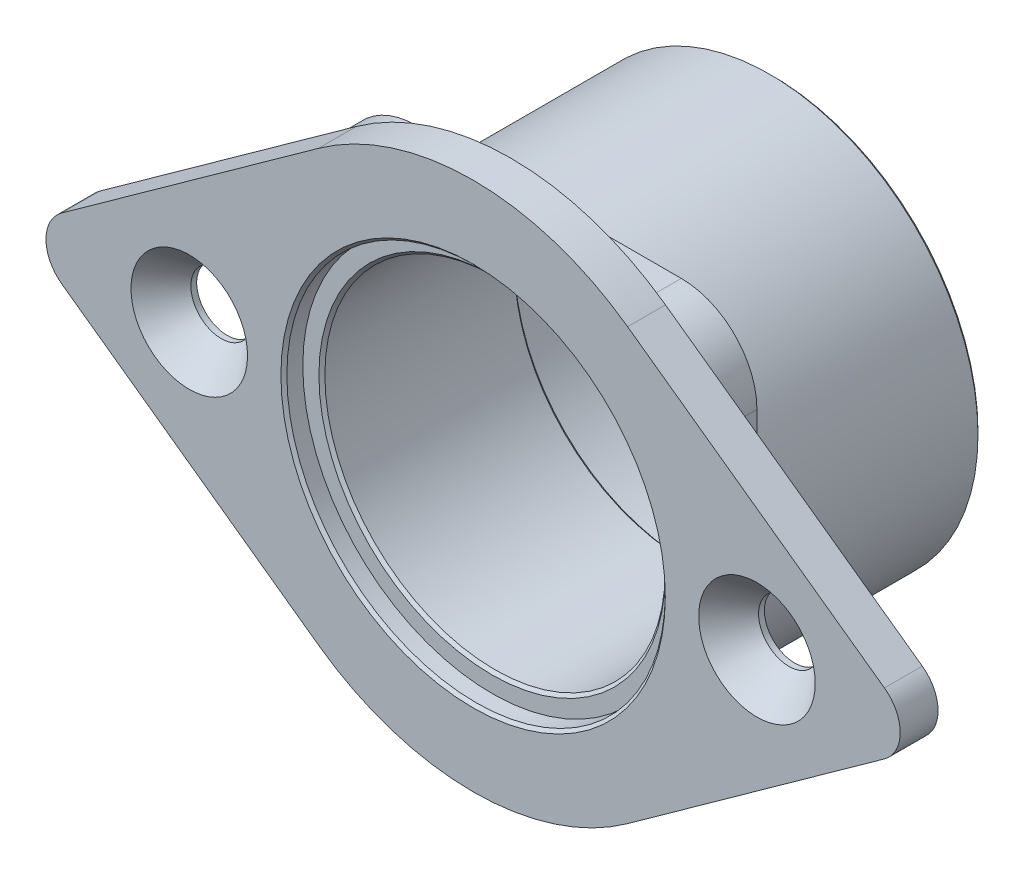
ISO-10303-21;
HEADER;
FILE_DESCRIPTION(('STEP AP214'),'2;1');
FILE_NAME('part.step','',(''),(''),'','','');
FILE_SCHEMA(('AUTOMOTIVE_DESIGN { 1 0 10303 214 1 1 1 1 }'));
ENDSEC;
DATA;
#1=APPLICATION_CONTEXT('core data for automotive mechanical design processes');
#2=APPLICATION_PROTOCOL_DEFINITION('international standard','automotive_design',2000,#1);
#3=PRODUCT_CONTEXT('',#1,'mechanical');
#4=PRODUCT('Part','Part','',(#3));
#5=PRODUCT_RELATED_PRODUCT_CATEGORY('part','',(#4));
#6=PRODUCT_DEFINITION_FORMATION('','',#4);
#7=PRODUCT_DEFINITION_CONTEXT('part definition',#1,'design');
#8=PRODUCT_DEFINITION('design','',#6,#7);
#9=PRODUCT_DEFINITION_SHAPE('','',#8);
#10=(LENGTH_UNIT() NAMED_UNIT(*) SI_UNIT(.MILLI.,.METRE.));
#11=(NAMED_UNIT(*) PLANE_ANGLE_UNIT() SI_UNIT($,.RADIAN.));
#12=(NAMED_UNIT(*) SI_UNIT($,.STERADIAN.) SOLID_ANGLE_UNIT());
#13=UNCERTAINTY_MEASURE_WITH_UNIT(LENGTH_MEASURE(1.E-05),#10,'distance_accuracy_value','');
#14=(GEOMETRIC_REPRESENTATION_CONTEXT(3) GLOBAL_UNCERTAINTY_ASSIGNED_CONTEXT((#13)) GLOBAL_UNIT_ASSIGNED_CONTEXT((#10,
#11,#12)) REPRESENTATION_CONTEXT('',''));
#15=CARTESIAN_POINT('',(0.,0.,0.));
#16=DIRECTION('',(0.,0.,1.));
#17=DIRECTION('',(1.,0.,0.));
#18=AXIS2_PLACEMENT_3D('',#15,#16,#17);
#19=CARTESIAN_POINT('',(-11.1125,-11.1125,-4.7625));
#20=DIRECTION('',(0.,0.,1.));
#21=DIRECTION('',(1.,0.,0.));
#22=AXIS2_PLACEMENT_3D('',#19,#20,#21);
#23=PLANE('',#22);
#24=DIRECTION('',(0.,-1.,0.));
#25=VECTOR('',#24,1.);
#26=CARTESIAN_POINT('',(17.4625,-11.1125,-4.7625));
#27=LINE('',#26,#25);
#28=CARTESIAN_POINT('',(17.4625,11.1125,-4.7625));
#29=VERTEX_POINT('',#28);
#30=CARTESIAN_POINT('',(17.4625,0.,-4.7625));
#31=VERTEX_POINT('',#30);
#32=EDGE_CURVE('E188',#29,#31,#27,.T.);
#33=ORIENTED_EDGE('',*,*,#32,.T.);
#34=CARTESIAN_POINT('',(0.,0.,-4.7625));
#35=DIRECTION('',(0.,0.,1.));
#36=DIRECTION('',(1.,0.,0.));
#37=AXIS2_PLACEMENT_3D('',#34,#35,#36);
#38=CIRCLE('',#37,17.4625);
#39=CARTESIAN_POINT('',(0.,17.4625,-4.7625));
#40=VERTEX_POINT('',#39);
#41=EDGE_CURVE('E173',#31,#40,#38,.T.);
#42=ORIENTED_EDGE('',*,*,#41,.T.);
#43=DIRECTION('',(1.,0.,0.));
#44=VECTOR('',#43,1.);
#45=CARTESIAN_POINT('',(11.1125,17.4625,-4.7625));
#46=LINE('',#45,#44);
#47=CARTESIAN_POINT('',(11.1125,17.4625,-4.7625));
#48=VERTEX_POINT('',#47);
#49=EDGE_CURVE('E185',#40,#48,#46,.T.);
#50=ORIENTED_EDGE('',*,*,#49,.T.);
#51=CARTESIAN_POINT('',(11.1125,11.1125,-4.7625));
#52=DIRECTION('',(0.,0.,-1.));
#53=DIRECTION('',(1.,0.,0.));
#54=AXIS2_PLACEMENT_3D('',#51,#52,#53);
#55=CIRCLE('',#54,6.35);
#56=EDGE_CURVE('E206',#48,#29,#55,.T.);
#57=ORIENTED_EDGE('',*,*,#56,.T.);
#58=EDGE_LOOP('',(#33,#42,#50,#57));
#59=FACE_BOUND('',#58,.T.);
#60=ADVANCED_FACE('F46',(#59),#23,.F.);
#61=CARTESIAN_POINT('',(-11.1125,17.4625,-4.7625));
#62=VERTEX_POINT('',#61);
#63=EDGE_CURVE('E197',#62,#40,#46,.T.);
#64=ORIENTED_EDGE('',*,*,#63,.T.);
#65=CARTESIAN_POINT('',(-17.4625,0.,-4.7625));
#66=VERTEX_POINT('',#65);
#67=EDGE_CURVE('E170',#40,#66,#38,.T.);
#68=ORIENTED_EDGE('',*,*,#67,.T.);
#69=DIRECTION('',(0.,1.,0.));
#70=VECTOR('',#69,1.);
#71=CARTESIAN_POINT('',(-17.4625,11.1125,-4.7625));
#72=LINE('',#71,#70);
#73=CARTESIAN_POINT('',(-17.4625,11.1125,-4.7625));
#74=VERTEX_POINT('',#73);
#75=EDGE_CURVE('E425',#66,#74,#72,.T.);
#76=ORIENTED_EDGE('',*,*,#75,.T.);
#77=CARTESIAN_POINT('',(-11.1125,11.1125,-4.7625));
#78=DIRECTION('',(0.,0.,-1.));
#79=DIRECTION('',(1.,0.,0.));
#80=AXIS2_PLACEMENT_3D('',#77,#78,#79);
#81=CIRCLE('',#80,6.35);
#82=EDGE_CURVE('E201',#74,#62,#81,.T.);
#83=ORIENTED_EDGE('',*,*,#82,.T.);
#84=EDGE_LOOP('',(#64,#68,#76,#83));
#85=FACE_BOUND('',#84,.T.);
#86=ADVANCED_FACE('F203',(#85),#23,.F.);
#87=CARTESIAN_POINT('',(-17.4625,-11.1125,-4.7625));
#88=VERTEX_POINT('',#87);
#89=EDGE_CURVE('E420',#88,#66,#72,.T.);
#90=ORIENTED_EDGE('',*,*,#89,.T.);
#91=CARTESIAN_POINT('',(0.,-17.4625,-4.7625));
#92=VERTEX_POINT('',#91);
#93=EDGE_CURVE('E176',#66,#92,#38,.T.);
#94=ORIENTED_EDGE('',*,*,#93,.T.);
#95=DIRECTION('',(-1.,0.,0.));
#96=VECTOR('',#95,1.);
#97=CARTESIAN_POINT('',(-11.1125,-17.4625,-4.7625));
#98=LINE('',#97,#96);
#99=CARTESIAN_POINT('',(-11.1125,-17.4625,-4.7625));
#100=VERTEX_POINT('',#99);
#101=EDGE_CURVE('E215',#92,#100,#98,.T.);
#102=ORIENTED_EDGE('',*,*,#101,.T.);
#103=CARTESIAN_POINT('',(-11.1125,-11.1125,-4.7625));
#104=DIRECTION('',(0.,0.,-1.));
#105=DIRECTION('',(1.,0.,0.));
#106=AXIS2_PLACEMENT_3D('',#103,#104,#105);
#107=CIRCLE('',#106,6.35);
#108=EDGE_CURVE('E242',#100,#88,#107,.T.);
#109=ORIENTED_EDGE('',*,*,#108,.T.);
#110=EDGE_LOOP('',(#90,#94,#102,#109));
#111=FACE_BOUND('',#110,.T.);
#112=ADVANCED_FACE('F397',(#111),#23,.F.);
#113=CARTESIAN_POINT('',(-32.6571428571429,0.,-1.5875));
#114=DIRECTION('',(0.,0.,1.));
#115=DIRECTION('',(1.,0.,0.));
#116=AXIS2_PLACEMENT_3D('',#113,#114,#115);
#117=PLANE('',#116);
#118=CARTESIAN_POINT('',(-23.8125,0.,-1.5875));
#119=DIRECTION('',(0.,0.,1.));
#120=DIRECTION('',(1.,0.,0.));
#121=AXIS2_PLACEMENT_3D('',#118,#119,#120);
#122=CIRCLE('',#121,2.55270000000001);
#123=CARTESIAN_POINT('',(-21.2598,0.,-1.5875));
#124=VERTEX_POINT('',#123);
#125=EDGE_CURVE('E309',#124,#124,#122,.T.);
#126=ORIENTED_EDGE('',*,*,#125,.T.);
#127=EDGE_LOOP('',(#126));
#128=FACE_BOUND('',#127,.T.);
#129=CARTESIAN_POINT('',(23.8125,0.,-1.5875));
#130=DIRECTION('',(0.,0.,1.));
#131=DIRECTION('',(1.,0.,0.));
#132=AXIS2_PLACEMENT_3D('',#129,#130,#131);
#133=CIRCLE('',#132,2.55270000000001);
#134=CARTESIAN_POINT('',(26.3652,0.,-1.5875));
#135=VERTEX_POINT('',#134);
#136=EDGE_CURVE('E304',#135,#135,#133,.T.);
#137=ORIENTED_EDGE('',*,*,#136,.T.);
#138=EDGE_LOOP('',(#137));
#139=FACE_BOUND('',#138,.T.);
#140=DIRECTION('',(0.812232862067414,0.583333333333334,0.));
#141=VECTOR('',#140,1.);
#142=CARTESIAN_POINT('',(0.,-27.3628426501111,-1.5875));
#143=LINE('',#142,#141);
#144=CARTESIAN_POINT('',(12.9645833333334,-18.0518753594483,-1.5875));
#145=VERTEX_POINT('',#144);
#146=CARTESIAN_POINT('',(34.5092261904762,-2.57883933706403,-1.5875));
#147=VERTEX_POINT('',#146);
#148=EDGE_CURVE('E271',#145,#147,#143,.T.);
#149=ORIENTED_EDGE('',*,*,#148,.F.);
#150=CARTESIAN_POINT('',(0.,0.,-1.5875));
#151=DIRECTION('',(0.,0.,1.));
#152=DIRECTION('',(1.,0.,0.));
#153=AXIS2_PLACEMENT_3D('',#150,#151,#152);
#154=CIRCLE('',#153,22.225);
#155=CARTESIAN_POINT('',(-12.9645833333333,-18.0518753594483,-1.5875));
#156=VERTEX_POINT('',#155);
#157=EDGE_CURVE('E353',#145,#156,#154,.F.);
#158=ORIENTED_EDGE('',*,*,#157,.T.);
#159=DIRECTION('',(0.812232862067414,-0.583333333333333,0.));
#160=VECTOR('',#159,1.);
#161=CARTESIAN_POINT('',(-34.5092261904762,-2.57883933706404,-1.5875));
#162=LINE('',#161,#160);
#163=CARTESIAN_POINT('',(-34.5092261904762,-2.57883933706404,-1.5875));
#164=VERTEX_POINT('',#163);
#165=EDGE_CURVE('E267',#164,#156,#162,.T.);
#166=ORIENTED_EDGE('',*,*,#165,.F.);
#167=CARTESIAN_POINT('',(-32.6571428571429,0.,-1.5875));
#168=DIRECTION('',(0.,0.,1.));
#169=DIRECTION('',(1.,0.,0.));
#170=AXIS2_PLACEMENT_3D('',#167,#168,#169);
#171=CIRCLE('',#170,3.175);
#172=CARTESIAN_POINT('',(-34.5092261904762,2.57883933706403,-1.5875));
#173=VERTEX_POINT('',#172);
#174=EDGE_CURVE('E264',#173,#164,#171,.T.);
#175=ORIENTED_EDGE('',*,*,#174,.F.);
#176=DIRECTION('',(-0.812232862067414,-0.583333333333333,0.));
#177=VECTOR('',#176,1.);
#178=CARTESIAN_POINT('',(0.,27.362842650111,-1.5875));
#179=LINE('',#178,#177);
#180=CARTESIAN_POINT('',(-12.9645833333333,18.0518753594483,-1.5875));
#181=VERTEX_POINT('',#180);
#182=EDGE_CURVE('E278',#181,#173,#179,.T.);
#183=ORIENTED_EDGE('',*,*,#182,.F.);
#184=CARTESIAN_POINT('',(0.,0.,-1.5875));
#185=DIRECTION('',(0.,0.,1.));
#186=DIRECTION('',(1.,0.,0.));
#187=AXIS2_PLACEMENT_3D('',#184,#185,#186);
#188=CIRCLE('',#187,22.225);
#189=CARTESIAN_POINT('',(12.9645833333333,18.0518753594483,-1.5875));
#190=VERTEX_POINT('',#189);
#191=EDGE_CURVE('E61',#181,#190,#188,.F.);
#192=ORIENTED_EDGE('',*,*,#191,.T.);
#193=DIRECTION('',(-0.812232862067414,0.583333333333333,0.));
#194=VECTOR('',#193,1.);
#195=CARTESIAN_POINT('',(34.5092261904762,2.57883933706404,-1.5875));
#196=LINE('',#195,#194);
#197=CARTESIAN_POINT('',(34.5092261904762,2.57883933706404,-1.5875));
#198=VERTEX_POINT('',#197);
#199=EDGE_CURVE('E276',#198,#190,#196,.T.);
#200=ORIENTED_EDGE('',*,*,#199,.F.);
#201=CARTESIAN_POINT('',(32.6571428571429,0.,-1.5875));
#202=DIRECTION('',(0.,0.,1.));
#203=DIRECTION('',(1.,0.,0.));
#204=AXIS2_PLACEMENT_3D('',#201,#202,#203);
#205=CIRCLE('',#204,3.175);
#206=EDGE_CURVE('E273',#147,#198,#205,.T.);
#207=ORIENTED_EDGE('',*,*,#206,.F.);
#208=EDGE_LOOP('',(#149,#158,#166,#175,#183,#192,#200,#207));
#209=FACE_BOUND('',#208,.T.);
#210=CARTESIAN_POINT('',(-11.1125,-11.1125,-1.5875));
#211=DIRECTION('',(0.,0.,-1.));
#212=DIRECTION('',(1.,0.,0.));
#213=AXIS2_PLACEMENT_3D('',#210,#211,#212);
#214=CIRCLE('',#213,6.35);
#215=CARTESIAN_POINT('',(-11.1125,-17.4625,-1.5875));
#216=VERTEX_POINT('',#215);
#217=CARTESIAN_POINT('',(-17.4625,-11.1125,-1.5875));
#218=VERTEX_POINT('',#217);
#219=EDGE_CURVE('E189',#216,#218,#214,.T.);
#220=ORIENTED_EDGE('',*,*,#219,.F.);
#221=DIRECTION('',(-1.,0.,0.));
#222=VECTOR('',#221,1.);
#223=CARTESIAN_POINT('',(-11.1125,-17.4625,-1.5875));
#224=LINE('',#223,#222);
#225=CARTESIAN_POINT('',(11.1125,-17.4625,-1.5875));
#226=VERTEX_POINT('',#225);
#227=EDGE_CURVE('E239',#226,#216,#224,.T.);
#228=ORIENTED_EDGE('',*,*,#227,.F.);
#229=CARTESIAN_POINT('',(11.1125,-11.1125,-1.5875));
#230=DIRECTION('',(0.,0.,-1.));
#231=DIRECTION('',(1.,0.,0.));
#232=AXIS2_PLACEMENT_3D('',#229,#230,#231);
#233=CIRCLE('',#232,6.35);
#234=CARTESIAN_POINT('',(17.4625,-11.1125,-1.5875));
#235=VERTEX_POINT('',#234);
#236=EDGE_CURVE('E236',#235,#226,#233,.T.);
#237=ORIENTED_EDGE('',*,*,#236,.F.);
#238=DIRECTION('',(0.,-1.,0.));
#239=VECTOR('',#238,1.);
#240=CARTESIAN_POINT('',(17.4625,-11.1125,-1.5875));
#241=LINE('',#240,#239);
#242=CARTESIAN_POINT('',(17.4625,11.1125,-1.5875));
#243=VERTEX_POINT('',#242);
#244=EDGE_CURVE('E233',#243,#235,#241,.T.);
#245=ORIENTED_EDGE('',*,*,#244,.F.);
#246=CARTESIAN_POINT('',(11.1125,11.1125,-1.5875));
#247=DIRECTION('',(0.,0.,-1.));
#248=DIRECTION('',(1.,0.,0.));
#249=AXIS2_PLACEMENT_3D('',#246,#247,#248);
#250=CIRCLE('',#249,6.35);
#251=CARTESIAN_POINT('',(11.1125,17.4625,-1.5875));
#252=VERTEX_POINT('',#251);
#253=EDGE_CURVE('E230',#252,#243,#250,.T.);
#254=ORIENTED_EDGE('',*,*,#253,.F.);
#255=DIRECTION('',(1.,0.,0.));
#256=VECTOR('',#255,1.);
#257=CARTESIAN_POINT('',(11.1125,17.4625,-1.5875));
#258=LINE('',#257,#256);
#259=CARTESIAN_POINT('',(-11.1125,17.4625,-1.5875));
#260=VERTEX_POINT('',#259);
#261=EDGE_CURVE('E228',#260,#252,#258,.T.);
#262=ORIENTED_EDGE('',*,*,#261,.F.);
#263=CARTESIAN_POINT('',(-11.1125,11.1125,-1.5875));
#264=DIRECTION('',(0.,0.,-1.));
#265=DIRECTION('',(1.,0.,0.));
#266=AXIS2_PLACEMENT_3D('',#263,#264,#265);
#267=CIRCLE('',#266,6.35);
#268=CARTESIAN_POINT('',(-17.4625,11.1125,-1.5875));
#269=VERTEX_POINT('',#268);
#270=EDGE_CURVE('E225',#269,#260,#267,.T.);
#271=ORIENTED_EDGE('',*,*,#270,.F.);
#272=DIRECTION('',(0.,1.,0.));
#273=VECTOR('',#272,1.);
#274=CARTESIAN_POINT('',(-17.4625,11.1125,-1.5875));
#275=LINE('',#274,#273);
#276=EDGE_CURVE('E222',#218,#269,#275,.T.);
#277=ORIENTED_EDGE('',*,*,#276,.F.);
#278=EDGE_LOOP('',(#220,#228,#237,#245,#254,#262,#271,#277));
#279=FACE_BOUND('',#278,.T.);
#280=ADVANCED_FACE('F369',(#128,#139,#209,#279),#117,.F.);
#281=CARTESIAN_POINT('',(-32.6571428571429,0.,-1.5875));
#282=DIRECTION('',(0.,0.,1.));
#283=DIRECTION('',(1.,0.,0.));
#284=AXIS2_PLACEMENT_3D('',#281,#282,#283);
#285=CYLINDRICAL_SURFACE('',#284,3.175);
#286=CARTESIAN_POINT('',(-32.6571428571429,0.,1.5875));
#287=DIRECTION('',(0.,0.,1.));
#288=DIRECTION('',(1.,0.,0.));
#289=AXIS2_PLACEMENT_3D('',#286,#287,#288);
#290=CIRCLE('',#289,3.175);
#291=CARTESIAN_POINT('',(-34.5092261904762,2.57883933706403,1.5875));
#292=VERTEX_POINT('',#291);
#293=CARTESIAN_POINT('',(-34.5092261904762,-2.57883933706404,1.5875));
#294=VERTEX_POINT('',#293);
#295=EDGE_CURVE('E263',#292,#294,#290,.T.);
#296=ORIENTED_EDGE('',*,*,#295,.F.);
#297=DIRECTION('',(0.,0.,1.));
#298=VECTOR('',#297,1.);
#299=CARTESIAN_POINT('',(-34.5092261904762,2.57883933706403,-1.5875));
#300=LINE('',#299,#298);
#301=EDGE_CURVE('E295',#173,#292,#300,.T.);
#302=ORIENTED_EDGE('',*,*,#301,.F.);
#303=ORIENTED_EDGE('',*,*,#174,.T.);
#304=DIRECTION('',(0.,0.,1.));
#305=VECTOR('',#304,1.);
#306=CARTESIAN_POINT('',(-34.5092261904762,-2.57883933706404,-1.5875));
#307=LINE('',#306,#305);
#308=EDGE_CURVE('E280',#164,#294,#307,.T.);
#309=ORIENTED_EDGE('',*,*,#308,.T.);
#310=EDGE_LOOP('',(#296,#302,#303,#309));
#311=FACE_BOUND('',#310,.T.);
#312=ADVANCED_FACE('F384',(#311),#285,.T.);
#313=CARTESIAN_POINT('',(0.,27.362842650111,-1.5875));
#314=DIRECTION('',(-0.583333333333333,0.812232862067414,0.));
#315=DIRECTION('',(-0.812232862067414,-0.583333333333333,0.));
#316=AXIS2_PLACEMENT_3D('',#313,#314,#315);
#317=PLANE('',#316);
#318=DIRECTION('',(-0.812232862067414,-0.583333333333333,0.));
#319=VECTOR('',#318,1.);
#320=CARTESIAN_POINT('',(0.,27.362842650111,1.5875));
#321=LINE('',#320,#319);
#322=CARTESIAN_POINT('',(-12.9645833333333,18.0518753594483,1.5875));
#323=VERTEX_POINT('',#322);
#324=EDGE_CURVE('E268',#323,#292,#321,.T.);
#325=ORIENTED_EDGE('',*,*,#324,.F.);
#326=DIRECTION('',(0.,0.,1.));
#327=VECTOR('',#326,1.);
#328=CARTESIAN_POINT('',(-12.9645833333333,18.0518753594483,-1.5875));
#329=LINE('',#328,#327);
#330=EDGE_CURVE('E13',#323,#181,#329,.F.);
#331=ORIENTED_EDGE('',*,*,#330,.T.);
#332=ORIENTED_EDGE('',*,*,#182,.T.);
#333=ORIENTED_EDGE('',*,*,#301,.T.);
#334=EDGE_LOOP('',(#325,#331,#332,#333));
#335=FACE_BOUND('',#334,.T.);
#336=ADVANCED_FACE('F572',(#335),#317,.T.);
#337=CARTESIAN_POINT('',(34.5092261904762,2.57883933706404,-1.5875));
#338=DIRECTION('',(0.583333333333333,0.812232862067414,0.));
#339=DIRECTION('',(-0.812232862067414,0.583333333333333,0.));
#340=AXIS2_PLACEMENT_3D('',#337,#338,#339);
#341=PLANE('',#340);
#342=ORIENTED_EDGE('',*,*,#199,.T.);
#343=DIRECTION('',(0.,0.,1.));
#344=VECTOR('',#343,1.);
#345=CARTESIAN_POINT('',(12.9645833333333,18.0518753594483,-1.5875));
#346=LINE('',#345,#344);
#347=CARTESIAN_POINT('',(12.9645833333333,18.0518753594483,1.5875));
#348=VERTEX_POINT('',#347);
#349=EDGE_CURVE('E54',#190,#348,#346,.T.);
#350=ORIENTED_EDGE('',*,*,#349,.T.);
#351=DIRECTION('',(-0.812232862067414,0.583333333333333,0.));
#352=VECTOR('',#351,1.);
#353=CARTESIAN_POINT('',(34.5092261904762,2.57883933706404,1.5875));
#354=LINE('',#353,#352);
#355=CARTESIAN_POINT('',(34.5092261904762,2.57883933706404,1.5875));
#356=VERTEX_POINT('',#355);
#357=EDGE_CURVE('E291',#356,#348,#354,.T.);
#358=ORIENTED_EDGE('',*,*,#357,.F.);
#359=DIRECTION('',(0.,0.,1.));
#360=VECTOR('',#359,1.);
#361=CARTESIAN_POINT('',(34.5092261904762,2.57883933706404,-1.5875));
#362=LINE('',#361,#360);
#363=EDGE_CURVE('E298',#198,#356,#362,.T.);
#364=ORIENTED_EDGE('',*,*,#363,.F.);
#365=EDGE_LOOP('',(#342,#350,#358,#364));
#366=FACE_BOUND('',#365,.T.);
#367=ADVANCED_FACE('F358',(#366),#341,.T.);
#368=CARTESIAN_POINT('',(32.6571428571429,0.,-1.5875));
#369=DIRECTION('',(0.,0.,1.));
#370=DIRECTION('',(1.,0.,0.));
#371=AXIS2_PLACEMENT_3D('',#368,#369,#370);
#372=CYLINDRICAL_SURFACE('',#371,3.175);
#373=CARTESIAN_POINT('',(32.6571428571429,0.,1.5875));
#374=DIRECTION('',(0.,0.,1.));
#375=DIRECTION('',(1.,0.,0.));
#376=AXIS2_PLACEMENT_3D('',#373,#374,#375);
#377=CIRCLE('',#376,3.175);
#378=CARTESIAN_POINT('',(34.5092261904762,-2.57883933706403,1.5875));
#379=VERTEX_POINT('',#378);
#380=EDGE_CURVE('E288',#379,#356,#377,.T.);
#381=ORIENTED_EDGE('',*,*,#380,.F.);
#382=DIRECTION('',(0.,0.,1.));
#383=VECTOR('',#382,1.);
#384=CARTESIAN_POINT('',(34.5092261904762,-2.57883933706403,-1.5875));
#385=LINE('',#384,#383);
#386=EDGE_CURVE('E300',#147,#379,#385,.T.);
#387=ORIENTED_EDGE('',*,*,#386,.F.);
#388=ORIENTED_EDGE('',*,*,#206,.T.);
#389=ORIENTED_EDGE('',*,*,#363,.T.);
#390=EDGE_LOOP('',(#381,#387,#388,#389));
#391=FACE_BOUND('',#390,.T.);
#392=ADVANCED_FACE('F366',(#391),#372,.T.);
#393=CARTESIAN_POINT('',(0.,-27.3628426501111,-1.5875));
#394=DIRECTION('',(0.583333333333333,-0.812232862067413,0.));
#395=DIRECTION('',(0.812232862067414,0.583333333333334,0.));
#396=AXIS2_PLACEMENT_3D('',#393,#394,#395);
#397=PLANE('',#396);
#398=DIRECTION('',(0.812232862067414,0.583333333333334,0.));
#399=VECTOR('',#398,1.);
#400=CARTESIAN_POINT('',(0.,-27.3628426501111,1.5875));
#401=LINE('',#400,#399);
#402=CARTESIAN_POINT('',(12.9645833333334,-18.0518753594483,1.5875));
#403=VERTEX_POINT('',#402);
#404=EDGE_CURVE('E286',#403,#379,#401,.T.);
#405=ORIENTED_EDGE('',*,*,#404,.F.);
#406=DIRECTION('',(0.,0.,1.));
#407=VECTOR('',#406,1.);
#408=CARTESIAN_POINT('',(12.9645833333333,-18.0518753594483,-1.5875));
#409=LINE('',#408,#407);
#410=EDGE_CURVE('E350',#403,#145,#409,.F.);
#411=ORIENTED_EDGE('',*,*,#410,.T.);
#412=ORIENTED_EDGE('',*,*,#148,.T.);
#413=ORIENTED_EDGE('',*,*,#386,.T.);
#414=EDGE_LOOP('',(#405,#411,#412,#413));
#415=FACE_BOUND('',#414,.T.);
#416=ADVANCED_FACE('F553',(#415),#397,.T.);
#417=CARTESIAN_POINT('',(-34.5092261904762,-2.57883933706404,-1.5875));
#418=DIRECTION('',(-0.583333333333333,-0.812232862067414,0.));
#419=DIRECTION('',(0.812232862067414,-0.583333333333333,0.));
#420=AXIS2_PLACEMENT_3D('',#417,#418,#419);
#421=PLANE('',#420);
#422=ORIENTED_EDGE('',*,*,#165,.T.);
#423=DIRECTION('',(0.,0.,1.));
#424=VECTOR('',#423,1.);
#425=CARTESIAN_POINT('',(-12.9645833333333,-18.0518753594483,-1.5875));
#426=LINE('',#425,#424);
#427=CARTESIAN_POINT('',(-12.9645833333333,-18.0518753594483,1.5875));
#428=VERTEX_POINT('',#427);
#429=EDGE_CURVE('E343',#156,#428,#426,.T.);
#430=ORIENTED_EDGE('',*,*,#429,.T.);
#431=DIRECTION('',(0.812232862067414,-0.583333333333333,0.));
#432=VECTOR('',#431,1.);
#433=CARTESIAN_POINT('',(-34.5092261904762,-2.57883933706404,1.5875));
#434=LINE('',#433,#432);
#435=EDGE_CURVE('E283',#294,#428,#434,.T.);
#436=ORIENTED_EDGE('',*,*,#435,.F.);
#437=ORIENTED_EDGE('',*,*,#308,.F.);
#438=EDGE_LOOP('',(#422,#430,#436,#437));
#439=FACE_BOUND('',#438,.T.);
#440=ADVANCED_FACE('F380',(#439),#421,.T.);
#441=CARTESIAN_POINT('',(-32.6571428571429,0.,1.5875));
#442=DIRECTION('',(0.,0.,1.));
#443=DIRECTION('',(1.,0.,0.));
#444=AXIS2_PLACEMENT_3D('',#441,#442,#443);
#445=PLANE('',#444);
#446=CARTESIAN_POINT('',(0.,0.,1.5875));
#447=DIRECTION('',(0.,0.,1.));
#448=DIRECTION('',(1.,0.,0.));
#449=AXIS2_PLACEMENT_3D('',#446,#447,#448);
#450=CIRCLE('',#449,16.125);
#451=CARTESIAN_POINT('',(16.125,0.,1.5875));
#452=VERTEX_POINT('',#451);
#453=EDGE_CURVE('E180',#452,#452,#450,.F.);
#454=ORIENTED_EDGE('',*,*,#453,.T.);
#455=EDGE_LOOP('',(#454));
#456=FACE_BOUND('',#455,.T.);
#457=CARTESIAN_POINT('',(-23.8125,0.,1.5875));
#458=DIRECTION('',(0.,0.,1.));
#459=DIRECTION('',(1.,0.,0.));
#460=AXIS2_PLACEMENT_3D('',#457,#458,#459);
#461=CIRCLE('',#460,4.88949999991382);
#462=CARTESIAN_POINT('',(-18.9230000000862,0.,1.5875));
#463=VERTEX_POINT('',#462);
#464=EDGE_CURVE('E438',#463,#463,#461,.T.);
#465=ORIENTED_EDGE('',*,*,#464,.F.);
#466=EDGE_LOOP('',(#465));
#467=FACE_BOUND('',#466,.T.);
#468=CARTESIAN_POINT('',(23.8125,0.,1.5875));
#469=DIRECTION('',(0.,0.,1.));
#470=DIRECTION('',(1.,0.,0.));
#471=AXIS2_PLACEMENT_3D('',#468,#469,#470);
#472=CIRCLE('',#471,4.88949999991382);
#473=CARTESIAN_POINT('',(28.7019999999138,0.,1.5875));
#474=VERTEX_POINT('',#473);
#475=EDGE_CURVE('E312',#474,#474,#472,.T.);
#476=ORIENTED_EDGE('',*,*,#475,.F.);
#477=EDGE_LOOP('',(#476));
#478=FACE_BOUND('',#477,.T.);
#479=ORIENTED_EDGE('',*,*,#435,.T.);
#480=CARTESIAN_POINT('',(0.,0.,1.5875));
#481=DIRECTION('',(0.,0.,1.));
#482=DIRECTION('',(1.,0.,0.));
#483=AXIS2_PLACEMENT_3D('',#480,#481,#482);
#484=CIRCLE('',#483,22.225);
#485=EDGE_CURVE('E348',#428,#403,#484,.T.);
#486=ORIENTED_EDGE('',*,*,#485,.T.);
#487=ORIENTED_EDGE('',*,*,#404,.T.);
#488=ORIENTED_EDGE('',*,*,#380,.T.);
#489=ORIENTED_EDGE('',*,*,#357,.T.);
#490=CARTESIAN_POINT('',(0.,0.,1.5875));
#491=DIRECTION('',(0.,0.,1.));
#492=DIRECTION('',(1.,0.,0.));
#493=AXIS2_PLACEMENT_3D('',#490,#491,#492);
#494=CIRCLE('',#493,22.225);
#495=EDGE_CURVE('E346',#348,#323,#494,.T.);
#496=ORIENTED_EDGE('',*,*,#495,.T.);
#497=ORIENTED_EDGE('',*,*,#324,.T.);
#498=ORIENTED_EDGE('',*,*,#295,.T.);
#499=EDGE_LOOP('',(#479,#486,#487,#488,#489,#496,#497,#498));
#500=FACE_BOUND('',#499,.T.);
#501=ADVANCED_FACE('F361',(#456,#467,#478,#500),#445,.T.);
#502=CARTESIAN_POINT('',(-11.1125,-11.1125,-4.7625));
#503=DIRECTION('',(0.,0.,1.));
#504=DIRECTION('',(1.,0.,0.));
#505=AXIS2_PLACEMENT_3D('',#502,#503,#504);
#506=CYLINDRICAL_SURFACE('',#505,6.35);
#507=ORIENTED_EDGE('',*,*,#219,.T.);
#508=DIRECTION('',(0.,0.,1.));
#509=VECTOR('',#508,1.);
#510=CARTESIAN_POINT('',(-17.4625,-11.1125,-4.7625));
#511=LINE('',#510,#509);
#512=EDGE_CURVE('E260',#88,#218,#511,.T.);
#513=ORIENTED_EDGE('',*,*,#512,.F.);
#514=ORIENTED_EDGE('',*,*,#108,.F.);
#515=DIRECTION('',(0.,0.,1.));
#516=VECTOR('',#515,1.);
#517=CARTESIAN_POINT('',(-11.1125,-17.4625,-4.7625));
#518=LINE('',#517,#516);
#519=EDGE_CURVE('E219',#100,#216,#518,.T.);
#520=ORIENTED_EDGE('',*,*,#519,.T.);
#521=EDGE_LOOP('',(#507,#513,#514,#520));
#522=FACE_BOUND('',#521,.T.);
#523=ADVANCED_FACE('F446',(#522),#506,.T.);
#524=CARTESIAN_POINT('',(-17.4625,11.1125,-4.7625));
#525=DIRECTION('',(1.,0.,0.));
#526=DIRECTION('',(0.,0.,-1.));
#527=AXIS2_PLACEMENT_3D('',#524,#525,#526);
#528=PLANE('',#527);
#529=ORIENTED_EDGE('',*,*,#276,.T.);
#530=DIRECTION('',(0.,0.,1.));
#531=VECTOR('',#530,1.);
#532=CARTESIAN_POINT('',(-17.4625,11.1125,-4.7625));
#533=LINE('',#532,#531);
#534=EDGE_CURVE('E257',#74,#269,#533,.T.);
#535=ORIENTED_EDGE('',*,*,#534,.F.);
#536=ORIENTED_EDGE('',*,*,#75,.F.);
#537=ORIENTED_EDGE('',*,*,#89,.F.);
#538=ORIENTED_EDGE('',*,*,#512,.T.);
#539=EDGE_LOOP('',(#529,#535,#536,#537,#538));
#540=FACE_BOUND('',#539,.T.);
#541=ADVANCED_FACE('F606',(#540),#528,.F.);
#542=CARTESIAN_POINT('',(-11.1125,11.1125,-4.7625));
#543=DIRECTION('',(0.,0.,1.));
#544=DIRECTION('',(1.,0.,0.));
#545=AXIS2_PLACEMENT_3D('',#542,#543,#544);
#546=CYLINDRICAL_SURFACE('',#545,6.35);
#547=ORIENTED_EDGE('',*,*,#270,.T.);
#548=DIRECTION('',(0.,0.,1.));
#549=VECTOR('',#548,1.);
#550=CARTESIAN_POINT('',(-11.1125,17.4625,-4.7625));
#551=LINE('',#550,#549);
#552=EDGE_CURVE('E255',#62,#260,#551,.T.);
#553=ORIENTED_EDGE('',*,*,#552,.F.);
#554=ORIENTED_EDGE('',*,*,#82,.F.);
#555=ORIENTED_EDGE('',*,*,#534,.T.);
#556=EDGE_LOOP('',(#547,#553,#554,#555));
#557=FACE_BOUND('',#556,.T.);
#558=ADVANCED_FACE('F614',(#557),#546,.T.);
#559=CARTESIAN_POINT('',(11.1125,17.4625,-4.7625));
#560=DIRECTION('',(0.,-1.,0.));
#561=DIRECTION('',(0.,0.,-1.));
#562=AXIS2_PLACEMENT_3D('',#559,#560,#561);
#563=PLANE('',#562);
#564=ORIENTED_EDGE('',*,*,#261,.T.);
#565=DIRECTION('',(0.,0.,1.));
#566=VECTOR('',#565,1.);
#567=CARTESIAN_POINT('',(11.1125,17.4625,-4.7625));
#568=LINE('',#567,#566);
#569=EDGE_CURVE('E199',#48,#252,#568,.T.);
#570=ORIENTED_EDGE('',*,*,#569,.F.);
#571=ORIENTED_EDGE('',*,*,#49,.F.);
#572=ORIENTED_EDGE('',*,*,#63,.F.);
#573=ORIENTED_EDGE('',*,*,#552,.T.);
#574=EDGE_LOOP('',(#564,#570,#571,#572,#573));
#575=FACE_BOUND('',#574,.T.);
#576=ADVANCED_FACE('F195',(#575),#563,.F.);
#577=CARTESIAN_POINT('',(11.1125,11.1125,-4.7625));
#578=DIRECTION('',(0.,0.,1.));
#579=DIRECTION('',(1.,0.,0.));
#580=AXIS2_PLACEMENT_3D('',#577,#578,#579);
#581=CYLINDRICAL_SURFACE('',#580,6.35);
#582=ORIENTED_EDGE('',*,*,#253,.T.);
#583=DIRECTION('',(0.,0.,1.));
#584=VECTOR('',#583,1.);
#585=CARTESIAN_POINT('',(17.4625,11.1125,-4.7625));
#586=LINE('',#585,#584);
#587=EDGE_CURVE('E251',#29,#243,#586,.T.);
#588=ORIENTED_EDGE('',*,*,#587,.F.);
#589=ORIENTED_EDGE('',*,*,#56,.F.);
#590=ORIENTED_EDGE('',*,*,#569,.T.);
#591=EDGE_LOOP('',(#582,#588,#589,#590));
#592=FACE_BOUND('',#591,.T.);
#593=ADVANCED_FACE('F626',(#592),#581,.T.);
#594=CARTESIAN_POINT('',(17.4625,-11.1125,-4.7625));
#595=DIRECTION('',(-1.,0.,0.));
#596=DIRECTION('',(0.,0.,1.));
#597=AXIS2_PLACEMENT_3D('',#594,#595,#596);
#598=PLANE('',#597);
#599=ORIENTED_EDGE('',*,*,#244,.T.);
#600=DIRECTION('',(0.,0.,1.));
#601=VECTOR('',#600,1.);
#602=CARTESIAN_POINT('',(17.4625,-11.1125,-4.7625));
#603=LINE('',#602,#601);
#604=CARTESIAN_POINT('',(17.4625,-11.1125,-4.7625));
#605=VERTEX_POINT('',#604);
#606=EDGE_CURVE('E248',#605,#235,#603,.T.);
#607=ORIENTED_EDGE('',*,*,#606,.F.);
#608=EDGE_CURVE('E207',#31,#605,#27,.T.);
#609=ORIENTED_EDGE('',*,*,#608,.F.);
#610=ORIENTED_EDGE('',*,*,#32,.F.);
#611=ORIENTED_EDGE('',*,*,#587,.T.);
#612=EDGE_LOOP('',(#599,#607,#609,#610,#611));
#613=FACE_BOUND('',#612,.T.);
#614=ADVANCED_FACE('F631',(#613),#598,.F.);
#615=CARTESIAN_POINT('',(11.1125,-11.1125,-4.7625));
#616=DIRECTION('',(0.,0.,1.));
#617=DIRECTION('',(1.,0.,0.));
#618=AXIS2_PLACEMENT_3D('',#615,#616,#617);
#619=CYLINDRICAL_SURFACE('',#618,6.35);
#620=ORIENTED_EDGE('',*,*,#236,.T.);
#621=DIRECTION('',(0.,0.,1.));
#622=VECTOR('',#621,1.);
#623=CARTESIAN_POINT('',(11.1125,-17.4625,-4.7625));
#624=LINE('',#623,#622);
#625=CARTESIAN_POINT('',(11.1125,-17.4625,-4.7625));
#626=VERTEX_POINT('',#625);
#627=EDGE_CURVE('E245',#626,#226,#624,.T.);
#628=ORIENTED_EDGE('',*,*,#627,.F.);
#629=CARTESIAN_POINT('',(11.1125,-11.1125,-4.7625));
#630=DIRECTION('',(0.,0.,-1.));
#631=DIRECTION('',(1.,0.,0.));
#632=AXIS2_PLACEMENT_3D('',#629,#630,#631);
#633=CIRCLE('',#632,6.35);
#634=EDGE_CURVE('E213',#605,#626,#633,.T.);
#635=ORIENTED_EDGE('',*,*,#634,.F.);
#636=ORIENTED_EDGE('',*,*,#606,.T.);
#637=EDGE_LOOP('',(#620,#628,#635,#636));
#638=FACE_BOUND('',#637,.T.);
#639=ADVANCED_FACE('F409',(#638),#619,.T.);
#640=CARTESIAN_POINT('',(-11.1125,-17.4625,-4.7625));
#641=DIRECTION('',(0.,1.,0.));
#642=DIRECTION('',(0.,0.,1.));
#643=AXIS2_PLACEMENT_3D('',#640,#641,#642);
#644=PLANE('',#643);
#645=ORIENTED_EDGE('',*,*,#227,.T.);
#646=ORIENTED_EDGE('',*,*,#519,.F.);
#647=ORIENTED_EDGE('',*,*,#101,.F.);
#648=EDGE_CURVE('E216',#626,#92,#98,.T.);
#649=ORIENTED_EDGE('',*,*,#648,.F.);
#650=ORIENTED_EDGE('',*,*,#627,.T.);
#651=EDGE_LOOP('',(#645,#646,#647,#649,#650));
#652=FACE_BOUND('',#651,.T.);
#653=ADVANCED_FACE('F401',(#652),#644,.F.);
#654=ORIENTED_EDGE('',*,*,#648,.T.);
#655=EDGE_CURVE('E191',#92,#31,#38,.T.);
#656=ORIENTED_EDGE('',*,*,#655,.T.);
#657=ORIENTED_EDGE('',*,*,#608,.T.);
#658=ORIENTED_EDGE('',*,*,#634,.T.);
#659=EDGE_LOOP('',(#654,#656,#657,#658));
#660=FACE_BOUND('',#659,.T.);
#661=ADVANCED_FACE('F393',(#660),#23,.F.);
#662=CARTESIAN_POINT('',(0.,0.,-23.5585));
#663=DIRECTION('',(0.,0.,1.));
#664=DIRECTION('',(1.,0.,0.));
#665=AXIS2_PLACEMENT_3D('',#662,#663,#664);
#666=CYLINDRICAL_SURFACE('',#665,17.4625);
#667=CARTESIAN_POINT('',(0.,0.,-23.3085));
#668=DIRECTION('',(0.,0.,-1.));
#669=DIRECTION('',(-1.,0.,0.));
#670=AXIS2_PLACEMENT_3D('',#667,#668,#669);
#671=CIRCLE('',#670,17.4625);
#672=CARTESIAN_POINT('',(-17.4625,0.,-23.3085));
#673=VERTEX_POINT('',#672);
#674=EDGE_CURVE('E328',#673,#673,#671,.F.);
#675=ORIENTED_EDGE('',*,*,#674,.T.);
#676=EDGE_LOOP('',(#675));
#677=FACE_BOUND('',#676,.T.);
#678=ORIENTED_EDGE('',*,*,#41,.F.);
#679=ORIENTED_EDGE('',*,*,#655,.F.);
#680=ORIENTED_EDGE('',*,*,#93,.F.);
#681=ORIENTED_EDGE('',*,*,#67,.F.);
#682=EDGE_LOOP('',(#678,#679,#680,#681));
#683=FACE_BOUND('',#682,.T.);
#684=ADVANCED_FACE('F172',(#677,#683),#666,.T.);
#685=CARTESIAN_POINT('',(17.4625,0.,-23.5585));
#686=DIRECTION('',(0.,0.,-1.));
#687=DIRECTION('',(-1.,0.,0.));
#688=AXIS2_PLACEMENT_3D('',#685,#686,#687);
#689=PLANE('',#688);
#690=CARTESIAN_POINT('',(0.,0.,-23.5585));
#691=DIRECTION('',(0.,0.,-1.));
#692=DIRECTION('',(-1.,0.,0.));
#693=AXIS2_PLACEMENT_3D('',#690,#691,#692);
#694=CIRCLE('',#693,16.11865);
#695=CARTESIAN_POINT('',(-16.11865,0.,-23.5585));
#696=VERTEX_POINT('',#695);
#697=EDGE_CURVE('E325',#696,#696,#694,.F.);
#698=ORIENTED_EDGE('',*,*,#697,.T.);
#699=EDGE_LOOP('',(#698));
#700=FACE_BOUND('',#699,.T.);
#701=CARTESIAN_POINT('',(0.,0.,-23.5585));
#702=DIRECTION('',(0.,0.,-1.));
#703=DIRECTION('',(-1.,0.,0.));
#704=AXIS2_PLACEMENT_3D('',#701,#702,#703);
#705=CIRCLE('',#704,17.2125);
#706=CARTESIAN_POINT('',(-17.2125,0.,-23.5585));
#707=VERTEX_POINT('',#706);
#708=EDGE_CURVE('E322',#707,#707,#705,.T.);
#709=ORIENTED_EDGE('',*,*,#708,.T.);
#710=EDGE_LOOP('',(#709));
#711=FACE_BOUND('',#710,.T.);
#712=ADVANCED_FACE('F407',(#700,#711),#689,.T.);
#713=CARTESIAN_POINT('',(0.,0.,1.5875));
#714=DIRECTION('',(0.,0.,-1.));
#715=DIRECTION('',(-1.,0.,0.));
#716=AXIS2_PLACEMENT_3D('',#713,#714,#715);
#717=CYLINDRICAL_SURFACE('',#716,15.875);
#718=CARTESIAN_POINT('',(0.,0.,1.33749999999999));
#719=DIRECTION('',(0.,0.,1.));
#720=DIRECTION('',(1.,0.,0.));
#721=AXIS2_PLACEMENT_3D('',#718,#719,#720);
#722=CIRCLE('',#721,15.875);
#723=CARTESIAN_POINT('',(15.875,0.,1.33749999999999));
#724=VERTEX_POINT('',#723);
#725=EDGE_CURVE('E316',#724,#724,#722,.T.);
#726=ORIENTED_EDGE('',*,*,#725,.T.);
#727=EDGE_LOOP('',(#726));
#728=FACE_BOUND('',#727,.T.);
#729=CARTESIAN_POINT('',(0.,0.,0.));
#730=DIRECTION('',(0.,0.,-1.));
#731=DIRECTION('',(-1.,0.,0.));
#732=AXIS2_PLACEMENT_3D('',#729,#730,#731);
#733=CIRCLE('',#732,15.875);
#734=CARTESIAN_POINT('',(-15.875,0.,0.));
#735=VERTEX_POINT('',#734);
#736=EDGE_CURVE('E307',#735,#735,#733,.T.);
#737=ORIENTED_EDGE('',*,*,#736,.T.);
#738=EDGE_LOOP('',(#737));
#739=FACE_BOUND('',#738,.T.);
#740=ADVANCED_FACE('F483',(#728,#739),#717,.F.);
#741=CARTESIAN_POINT('',(0.,0.,1.5875));
#742=DIRECTION('',(0.,0.,-1.));
#743=DIRECTION('',(-1.,0.,0.));
#744=AXIS2_PLACEMENT_3D('',#741,#742,#743);
#745=CYLINDRICAL_SURFACE('',#744,15.86865);
#746=CARTESIAN_POINT('',(0.,0.,-23.3085));
#747=DIRECTION('',(0.,0.,-1.));
#748=DIRECTION('',(-1.,0.,0.));
#749=AXIS2_PLACEMENT_3D('',#746,#747,#748);
#750=CIRCLE('',#749,15.86865);
#751=CARTESIAN_POINT('',(-15.86865,0.,-23.3085));
#752=VERTEX_POINT('',#751);
#753=EDGE_CURVE('E319',#752,#752,#750,.T.);
#754=ORIENTED_EDGE('',*,*,#753,.T.);
#755=EDGE_LOOP('',(#754));
#756=FACE_BOUND('',#755,.T.);
#757=CARTESIAN_POINT('',(0.,0.,-16.41475));
#758=DIRECTION('',(0.,0.,-1.));
#759=DIRECTION('',(-1.,0.,0.));
#760=AXIS2_PLACEMENT_3D('',#757,#758,#759);
#761=CIRCLE('',#760,15.86865);
#762=CARTESIAN_POINT('',(-15.86865,0.,-16.41475));
#763=VERTEX_POINT('',#762);
#764=EDGE_CURVE('E190',#763,#763,#761,.T.);
#765=ORIENTED_EDGE('',*,*,#764,.F.);
#766=EDGE_LOOP('',(#765));
#767=FACE_BOUND('',#766,.T.);
#768=ADVANCED_FACE('F479',(#756,#767),#745,.F.);
#769=CARTESIAN_POINT('',(15.86865,0.,-16.41475));
#770=DIRECTION('',(0.,0.,1.));
#771=DIRECTION('',(1.,0.,0.));
#772=AXIS2_PLACEMENT_3D('',#769,#770,#771);
#773=PLANE('',#772);
#774=CARTESIAN_POINT('',(0.,0.,-16.41475));
#775=DIRECTION('',(0.,0.,1.));
#776=DIRECTION('',(1.,0.,0.));
#777=AXIS2_PLACEMENT_3D('',#774,#775,#776);
#778=CIRCLE('',#777,14.5248);
#779=CARTESIAN_POINT('',(14.5248,0.,-16.41475));
#780=VERTEX_POINT('',#779);
#781=EDGE_CURVE('E340',#780,#780,#778,.T.);
#782=ORIENTED_EDGE('',*,*,#781,.T.);
#783=EDGE_LOOP('',(#782));
#784=FACE_BOUND('',#783,.T.);
#785=ORIENTED_EDGE('',*,*,#764,.T.);
#786=EDGE_LOOP('',(#785));
#787=FACE_BOUND('',#786,.T.);
#788=ADVANCED_FACE('F475',(#784,#787),#773,.F.);
#789=CARTESIAN_POINT('',(0.,0.,1.5875));
#790=DIRECTION('',(0.,0.,-1.));
#791=DIRECTION('',(-1.,0.,0.));
#792=AXIS2_PLACEMENT_3D('',#789,#790,#791);
#793=CYLINDRICAL_SURFACE('',#792,14.2748);
#794=CARTESIAN_POINT('',(0.,0.,-0.249999999999997));
#795=DIRECTION('',(0.,0.,-1.));
#796=DIRECTION('',(-1.,0.,0.));
#797=AXIS2_PLACEMENT_3D('',#794,#795,#796);
#798=CIRCLE('',#797,14.2748);
#799=CARTESIAN_POINT('',(-14.2748,0.,-0.249999999999997));
#800=VERTEX_POINT('',#799);
#801=EDGE_CURVE('E337',#800,#800,#798,.F.);
#802=ORIENTED_EDGE('',*,*,#801,.T.);
#803=EDGE_LOOP('',(#802));
#804=FACE_BOUND('',#803,.T.);
#805=CARTESIAN_POINT('',(0.,0.,-16.16475));
#806=DIRECTION('',(0.,0.,1.));
#807=DIRECTION('',(1.,0.,0.));
#808=AXIS2_PLACEMENT_3D('',#805,#806,#807);
#809=CIRCLE('',#808,14.2748);
#810=CARTESIAN_POINT('',(14.2748,0.,-16.16475));
#811=VERTEX_POINT('',#810);
#812=EDGE_CURVE('E334',#811,#811,#809,.F.);
#813=ORIENTED_EDGE('',*,*,#812,.T.);
#814=EDGE_LOOP('',(#813));
#815=FACE_BOUND('',#814,.T.);
#816=ADVANCED_FACE('F471',(#804,#815),#793,.F.);
#817=CARTESIAN_POINT('',(14.2748,0.,0.));
#818=DIRECTION('',(0.,0.,-1.));
#819=DIRECTION('',(-1.,0.,0.));
#820=AXIS2_PLACEMENT_3D('',#817,#818,#819);
#821=PLANE('',#820);
#822=CARTESIAN_POINT('',(0.,0.,0.));
#823=DIRECTION('',(0.,0.,-1.));
#824=DIRECTION('',(-1.,0.,0.));
#825=AXIS2_PLACEMENT_3D('',#822,#823,#824);
#826=CIRCLE('',#825,14.5248);
#827=CARTESIAN_POINT('',(-14.5248,0.,0.));
#828=VERTEX_POINT('',#827);
#829=EDGE_CURVE('E331',#828,#828,#826,.T.);
#830=ORIENTED_EDGE('',*,*,#829,.T.);
#831=EDGE_LOOP('',(#830));
#832=FACE_BOUND('',#831,.T.);
#833=ORIENTED_EDGE('',*,*,#736,.F.);
#834=EDGE_LOOP('',(#833));
#835=FACE_BOUND('',#834,.T.);
#836=ADVANCED_FACE('F463',(#832,#835),#821,.F.);
#837=CARTESIAN_POINT('',(23.8125,0.,1.5875));
#838=DIRECTION('',(0.,0.,1.));
#839=DIRECTION('',(1.,0.,0.));
#840=AXIS2_PLACEMENT_3D('',#837,#838,#839);
#841=CYLINDRICAL_SURFACE('',#840,2.55270000000001);
#842=CARTESIAN_POINT('',(23.8125,0.,-1.10068089393144));
#843=DIRECTION('',(0.,0.,1.));
#844=DIRECTION('',(1.,0.,0.));
#845=AXIS2_PLACEMENT_3D('',#842,#843,#844);
#846=CIRCLE('',#845,2.55270000000001);
#847=CARTESIAN_POINT('',(26.3652,0.,-1.10068089393144));
#848=VERTEX_POINT('',#847);
#849=EDGE_CURVE('E308',#848,#848,#846,.T.);
#850=ORIENTED_EDGE('',*,*,#849,.T.);
#851=EDGE_LOOP('',(#850));
#852=FACE_BOUND('',#851,.T.);
#853=ORIENTED_EDGE('',*,*,#136,.F.);
#854=EDGE_LOOP('',(#853));
#855=FACE_BOUND('',#854,.T.);
#856=ADVANCED_FACE('F454',(#852,#855),#841,.F.);
#857=CARTESIAN_POINT('',(23.8125,0.,1.5875));
#858=DIRECTION('',(0.,0.,1.));
#859=DIRECTION('',(1.,0.,0.));
#860=AXIS2_PLACEMENT_3D('',#857,#858,#859);
#861=CONICAL_SURFACE('',#860,4.88949999991382,0.715584993310946);
#862=ORIENTED_EDGE('',*,*,#849,.F.);
#863=EDGE_LOOP('',(#862));
#864=FACE_BOUND('',#863,.T.);
#865=ORIENTED_EDGE('',*,*,#475,.T.);
#866=EDGE_LOOP('',(#865));
#867=FACE_BOUND('',#866,.T.);
#868=ADVANCED_FACE('F451',(#864,#867),#861,.F.);
#869=CARTESIAN_POINT('',(-23.8125,0.,1.5875));
#870=DIRECTION('',(0.,0.,1.));
#871=DIRECTION('',(1.,0.,0.));
#872=AXIS2_PLACEMENT_3D('',#869,#870,#871);
#873=CYLINDRICAL_SURFACE('',#872,2.55270000000001);
#874=CARTESIAN_POINT('',(-23.8125,0.,-1.10068089393144));
#875=DIRECTION('',(0.,0.,1.));
#876=DIRECTION('',(1.,0.,0.));
#877=AXIS2_PLACEMENT_3D('',#874,#875,#876);
#878=CIRCLE('',#877,2.55270000000001);
#879=CARTESIAN_POINT('',(-21.2598,0.,-1.10068089393144));
#880=VERTEX_POINT('',#879);
#881=EDGE_CURVE('E313',#880,#880,#878,.T.);
#882=ORIENTED_EDGE('',*,*,#881,.T.);
#883=EDGE_LOOP('',(#882));
#884=FACE_BOUND('',#883,.T.);
#885=ORIENTED_EDGE('',*,*,#125,.F.);
#886=EDGE_LOOP('',(#885));
#887=FACE_BOUND('',#886,.T.);
#888=ADVANCED_FACE('F453',(#884,#887),#873,.F.);
#889=CARTESIAN_POINT('',(-23.8125,0.,1.5875));
#890=DIRECTION('',(0.,0.,1.));
#891=DIRECTION('',(1.,0.,0.));
#892=AXIS2_PLACEMENT_3D('',#889,#890,#891);
#893=CONICAL_SURFACE('',#892,4.88949999991382,0.715584993310946);
#894=ORIENTED_EDGE('',*,*,#881,.F.);
#895=EDGE_LOOP('',(#894));
#896=FACE_BOUND('',#895,.T.);
#897=ORIENTED_EDGE('',*,*,#464,.T.);
#898=EDGE_LOOP('',(#897));
#899=FACE_BOUND('',#898,.T.);
#900=ADVANCED_FACE('F442',(#896,#899),#893,.F.);
#901=CARTESIAN_POINT('',(0.,0.,1.5875));
#902=DIRECTION('',(0.,0.,1.));
#903=DIRECTION('',(1.,0.,0.));
#904=AXIS2_PLACEMENT_3D('',#901,#902,#903);
#905=CONICAL_SURFACE('',#904,16.125,0.785398163397435);
#906=ORIENTED_EDGE('',*,*,#725,.F.);
#907=EDGE_LOOP('',(#906));
#908=FACE_BOUND('',#907,.T.);
#909=ORIENTED_EDGE('',*,*,#453,.F.);
#910=EDGE_LOOP('',(#909));
#911=FACE_BOUND('',#910,.T.);
#912=ADVANCED_FACE('F509',(#908,#911),#905,.F.);
#913=CARTESIAN_POINT('',(0.,0.,-23.3085));
#914=DIRECTION('',(0.,0.,-1.));
#915=DIRECTION('',(-1.,0.,0.));
#916=AXIS2_PLACEMENT_3D('',#913,#914,#915);
#917=CONICAL_SURFACE('',#916,15.86865,0.785398163397441);
#918=ORIENTED_EDGE('',*,*,#697,.F.);
#919=EDGE_LOOP('',(#918));
#920=FACE_BOUND('',#919,.T.);
#921=ORIENTED_EDGE('',*,*,#753,.F.);
#922=EDGE_LOOP('',(#921));
#923=FACE_BOUND('',#922,.T.);
#924=ADVANCED_FACE('F500',(#920,#923),#917,.F.);
#925=CARTESIAN_POINT('',(0.,0.,-23.3085));
#926=DIRECTION('',(0.,0.,1.));
#927=DIRECTION('',(1.,0.,0.));
#928=AXIS2_PLACEMENT_3D('',#925,#926,#927);
#929=CONICAL_SURFACE('',#928,17.4625,0.785398163397441);
#930=ORIENTED_EDGE('',*,*,#708,.F.);
#931=EDGE_LOOP('',(#930));
#932=FACE_BOUND('',#931,.T.);
#933=ORIENTED_EDGE('',*,*,#674,.F.);
#934=EDGE_LOOP('',(#933));
#935=FACE_BOUND('',#934,.T.);
#936=ADVANCED_FACE('F496',(#932,#935),#929,.T.);
#937=CARTESIAN_POINT('',(0.,0.,0.));
#938=DIRECTION('',(0.,0.,1.));
#939=DIRECTION('',(1.,0.,0.));
#940=AXIS2_PLACEMENT_3D('',#937,#938,#939);
#941=CONICAL_SURFACE('',#940,14.5248,0.785398163397431);
#942=ORIENTED_EDGE('',*,*,#801,.F.);
#943=EDGE_LOOP('',(#942));
#944=FACE_BOUND('',#943,.T.);
#945=ORIENTED_EDGE('',*,*,#829,.F.);
#946=EDGE_LOOP('',(#945));
#947=FACE_BOUND('',#946,.T.);
#948=ADVANCED_FACE('F499',(#944,#947),#941,.F.);
#949=CARTESIAN_POINT('',(0.,0.,-16.16475));
#950=DIRECTION('',(0.,0.,-1.));
#951=DIRECTION('',(-1.,0.,0.));
#952=AXIS2_PLACEMENT_3D('',#949,#950,#951);
#953=CONICAL_SURFACE('',#952,14.2748,0.785398163397441);
#954=ORIENTED_EDGE('',*,*,#781,.F.);
#955=EDGE_LOOP('',(#954));
#956=FACE_BOUND('',#955,.T.);
#957=ORIENTED_EDGE('',*,*,#812,.F.);
#958=EDGE_LOOP('',(#957));
#959=FACE_BOUND('',#958,.T.);
#960=ADVANCED_FACE('F390',(#956,#959),#953,.F.);
#961=CARTESIAN_POINT('',(0.,0.,-1.5875));
#962=DIRECTION('',(0.,0.,1.));
#963=DIRECTION('',(1.,0.,0.));
#964=AXIS2_PLACEMENT_3D('',#961,#962,#963);
#965=CYLINDRICAL_SURFACE('',#964,22.225);
#966=ORIENTED_EDGE('',*,*,#157,.F.);
#967=ORIENTED_EDGE('',*,*,#410,.F.);
#968=ORIENTED_EDGE('',*,*,#485,.F.);
#969=ORIENTED_EDGE('',*,*,#429,.F.);
#970=EDGE_LOOP('',(#966,#967,#968,#969));
#971=FACE_BOUND('',#970,.T.);
#972=ADVANCED_FACE('F377',(#971),#965,.T.);
#973=CARTESIAN_POINT('',(0.,0.,-1.5875));
#974=DIRECTION('',(0.,0.,1.));
#975=DIRECTION('',(1.,0.,0.));
#976=AXIS2_PLACEMENT_3D('',#973,#974,#975);
#977=CYLINDRICAL_SURFACE('',#976,22.225);
#978=ORIENTED_EDGE('',*,*,#191,.F.);
#979=ORIENTED_EDGE('',*,*,#330,.F.);
#980=ORIENTED_EDGE('',*,*,#495,.F.);
#981=ORIENTED_EDGE('',*,*,#349,.F.);
#982=EDGE_LOOP('',(#978,#979,#980,#981));
#983=FACE_BOUND('',#982,.T.);
#984=ADVANCED_FACE('F48',(#983),#977,.T.);
#985=CLOSED_SHELL('',(#60,#86,#112,#280,#312,#336,#367,#392,#416,#440,#501,#523,#541,#558,#576,
#593,#614,#639,#653,#661,#684,#712,#740,#768,#788,#816,#836,#856,#868,#888,#900,#912,#924,#936,
#948,#960,#972,#984));
#986=MANIFOLD_SOLID_BREP('B2',#985);
#987=ADVANCED_BREP_SHAPE_REPRESENTATION('',(#18,#986),#14);
#988=SHAPE_DEFINITION_REPRESENTATION(#9,#987);
ENDSEC;
END-ISO-10303-21;
